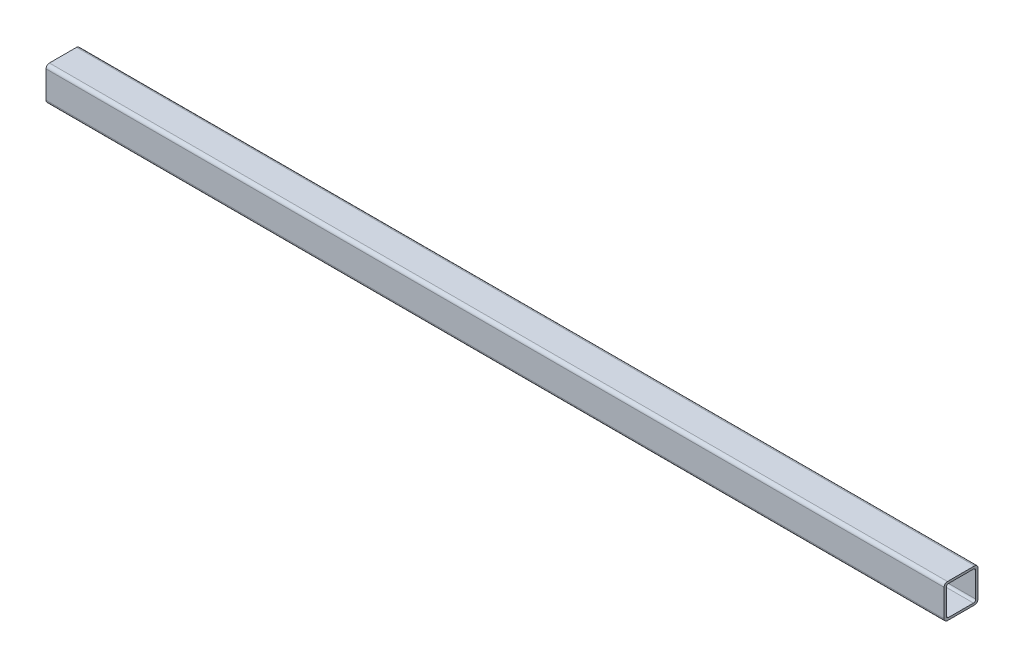
ISO-10303-21;
HEADER;
FILE_DESCRIPTION(('STEP AP214'),'2;1');
FILE_NAME('part.step','',(''),(''),'','','');
FILE_SCHEMA(('AUTOMOTIVE_DESIGN { 1 0 10303 214 1 1 1 1 }'));
ENDSEC;
DATA;
#1=APPLICATION_CONTEXT('core data for automotive mechanical design processes');
#2=APPLICATION_PROTOCOL_DEFINITION('international standard','automotive_design',2000,#1);
#3=PRODUCT_CONTEXT('',#1,'mechanical');
#4=PRODUCT('Part','Part','',(#3));
#5=PRODUCT_RELATED_PRODUCT_CATEGORY('part','',(#4));
#6=PRODUCT_DEFINITION_FORMATION('','',#4);
#7=PRODUCT_DEFINITION_CONTEXT('part definition',#1,'design');
#8=PRODUCT_DEFINITION('design','',#6,#7);
#9=PRODUCT_DEFINITION_SHAPE('','',#8);
#10=(LENGTH_UNIT() NAMED_UNIT(*) SI_UNIT(.MILLI.,.METRE.));
#11=(NAMED_UNIT(*) PLANE_ANGLE_UNIT() SI_UNIT($,.RADIAN.));
#12=(NAMED_UNIT(*) SI_UNIT($,.STERADIAN.) SOLID_ANGLE_UNIT());
#13=UNCERTAINTY_MEASURE_WITH_UNIT(LENGTH_MEASURE(1.E-05),#10,'distance_accuracy_value','');
#14=(GEOMETRIC_REPRESENTATION_CONTEXT(3) GLOBAL_UNCERTAINTY_ASSIGNED_CONTEXT((#13)) GLOBAL_UNIT_ASSIGNED_CONTEXT((#10,
#11,#12)) REPRESENTATION_CONTEXT('',''));
#15=CARTESIAN_POINT('',(0.,0.,0.));
#16=DIRECTION('',(0.,0.,1.));
#17=DIRECTION('',(1.,0.,0.));
#18=AXIS2_PLACEMENT_3D('',#15,#16,#17);
#19=CARTESIAN_POINT('',(-439.426406871193,0.,-3.));
#20=DIRECTION('',(0.,-1.,0.));
#21=DIRECTION('',(0.,0.,-1.));
#22=AXIS2_PLACEMENT_3D('',#19,#20,#21);
#23=PLANE('',#22);
#24=DIRECTION('',(0.,0.,1.));
#25=VECTOR('',#24,1.);
#26=CARTESIAN_POINT('',(-397.,0.,-3.));
#27=LINE('',#26,#25);
#28=CARTESIAN_POINT('',(-397.,0.,-27.));
#29=VERTEX_POINT('',#28);
#30=CARTESIAN_POINT('',(-397.,0.,-3.));
#31=VERTEX_POINT('',#30);
#32=EDGE_CURVE('E11',#29,#31,#27,.T.);
#33=ORIENTED_EDGE('',*,*,#32,.F.);
#34=DIRECTION('',(1.,0.,0.));
#35=VECTOR('',#34,1.);
#36=CARTESIAN_POINT('',(-439.426406871193,0.,-27.));
#37=LINE('',#36,#35);
#38=CARTESIAN_POINT('',(397.,0.,-27.));
#39=VERTEX_POINT('',#38);
#40=EDGE_CURVE('E237',#29,#39,#37,.T.);
#41=ORIENTED_EDGE('',*,*,#40,.T.);
#42=DIRECTION('',(0.,0.,1.));
#43=VECTOR('',#42,1.);
#44=CARTESIAN_POINT('',(397.,0.,-3.));
#45=LINE('',#44,#43);
#46=CARTESIAN_POINT('',(397.,0.,-3.));
#47=VERTEX_POINT('',#46);
#48=EDGE_CURVE('E154',#39,#47,#45,.T.);
#49=ORIENTED_EDGE('',*,*,#48,.T.);
#50=DIRECTION('',(1.,0.,0.));
#51=VECTOR('',#50,1.);
#52=CARTESIAN_POINT('',(-439.426406871193,0.,-3.));
#53=LINE('',#52,#51);
#54=EDGE_CURVE('E213',#31,#47,#53,.T.);
#55=ORIENTED_EDGE('',*,*,#54,.F.);
#56=EDGE_LOOP('',(#33,#41,#49,#55));
#57=FACE_BOUND('',#56,.T.);
#58=ADVANCED_FACE('F35',(#57),#23,.T.);
#59=CARTESIAN_POINT('',(-439.426406871193,3.,-27.));
#60=DIRECTION('',(1.,0.,0.));
#61=DIRECTION('',(0.,0.,-1.));
#62=AXIS2_PLACEMENT_3D('',#59,#60,#61);
#63=CYLINDRICAL_SURFACE('',#62,3.);
#64=CARTESIAN_POINT('',(-397.,3.,-27.));
#65=DIRECTION('',(1.,0.,0.));
#66=DIRECTION('',(0.,1.,0.));
#67=AXIS2_PLACEMENT_3D('',#64,#65,#66);
#68=CIRCLE('',#67,3.);
#69=CARTESIAN_POINT('',(-397.,3.,-30.));
#70=VERTEX_POINT('',#69);
#71=EDGE_CURVE('E199',#70,#29,#68,.F.);
#72=ORIENTED_EDGE('',*,*,#71,.F.);
#73=DIRECTION('',(1.,0.,0.));
#74=VECTOR('',#73,1.);
#75=CARTESIAN_POINT('',(-439.426406871193,3.,-30.));
#76=LINE('',#75,#74);
#77=CARTESIAN_POINT('',(397.,3.,-30.));
#78=VERTEX_POINT('',#77);
#79=EDGE_CURVE('E235',#70,#78,#76,.T.);
#80=ORIENTED_EDGE('',*,*,#79,.T.);
#81=CARTESIAN_POINT('',(397.,3.,-27.));
#82=DIRECTION('',(1.,0.,0.));
#83=DIRECTION('',(0.,1.,0.));
#84=AXIS2_PLACEMENT_3D('',#81,#82,#83);
#85=CIRCLE('',#84,3.);
#86=EDGE_CURVE('E172',#78,#39,#85,.F.);
#87=ORIENTED_EDGE('',*,*,#86,.T.);
#88=ORIENTED_EDGE('',*,*,#40,.F.);
#89=EDGE_LOOP('',(#72,#80,#87,#88));
#90=FACE_BOUND('',#89,.T.);
#91=ADVANCED_FACE('F297',(#90),#63,.T.);
#92=CARTESIAN_POINT('',(-439.426406871193,27.,-30.));
#93=DIRECTION('',(0.,0.,-1.));
#94=DIRECTION('',(0.,1.,0.));
#95=AXIS2_PLACEMENT_3D('',#92,#93,#94);
#96=PLANE('',#95);
#97=DIRECTION('',(0.,-1.,0.));
#98=VECTOR('',#97,1.);
#99=CARTESIAN_POINT('',(-397.,27.0000000000001,-30.));
#100=LINE('',#99,#98);
#101=CARTESIAN_POINT('',(-397.,27.,-30.));
#102=VERTEX_POINT('',#101);
#103=EDGE_CURVE('E201',#102,#70,#100,.T.);
#104=ORIENTED_EDGE('',*,*,#103,.F.);
#105=DIRECTION('',(1.,0.,0.));
#106=VECTOR('',#105,1.);
#107=CARTESIAN_POINT('',(-439.426406871193,27.,-30.));
#108=LINE('',#107,#106);
#109=CARTESIAN_POINT('',(397.,27.,-30.));
#110=VERTEX_POINT('',#109);
#111=EDGE_CURVE('E233',#102,#110,#108,.T.);
#112=ORIENTED_EDGE('',*,*,#111,.T.);
#113=DIRECTION('',(0.,-1.,0.));
#114=VECTOR('',#113,1.);
#115=CARTESIAN_POINT('',(397.,27.0000000000001,-30.));
#116=LINE('',#115,#114);
#117=EDGE_CURVE('E175',#110,#78,#116,.T.);
#118=ORIENTED_EDGE('',*,*,#117,.T.);
#119=ORIENTED_EDGE('',*,*,#79,.F.);
#120=EDGE_LOOP('',(#104,#112,#118,#119));
#121=FACE_BOUND('',#120,.T.);
#122=ADVANCED_FACE('F295',(#121),#96,.T.);
#123=CARTESIAN_POINT('',(-439.426406871193,27.,-27.));
#124=DIRECTION('',(1.,0.,0.));
#125=DIRECTION('',(0.,0.,-1.));
#126=AXIS2_PLACEMENT_3D('',#123,#124,#125);
#127=CYLINDRICAL_SURFACE('',#126,3.);
#128=CARTESIAN_POINT('',(-397.,27.,-27.));
#129=DIRECTION('',(1.,0.,0.));
#130=DIRECTION('',(0.,1.,0.));
#131=AXIS2_PLACEMENT_3D('',#128,#129,#130);
#132=CIRCLE('',#131,3.);
#133=CARTESIAN_POINT('',(-397.,30.,-27.));
#134=VERTEX_POINT('',#133);
#135=EDGE_CURVE('E203',#134,#102,#132,.F.);
#136=ORIENTED_EDGE('',*,*,#135,.F.);
#137=DIRECTION('',(1.,0.,0.));
#138=VECTOR('',#137,1.);
#139=CARTESIAN_POINT('',(-439.426406871193,30.,-27.));
#140=LINE('',#139,#138);
#141=CARTESIAN_POINT('',(397.,30.,-27.));
#142=VERTEX_POINT('',#141);
#143=EDGE_CURVE('E231',#134,#142,#140,.T.);
#144=ORIENTED_EDGE('',*,*,#143,.T.);
#145=CARTESIAN_POINT('',(397.,27.,-27.));
#146=DIRECTION('',(1.,0.,0.));
#147=DIRECTION('',(0.,1.,0.));
#148=AXIS2_PLACEMENT_3D('',#145,#146,#147);
#149=CIRCLE('',#148,3.);
#150=EDGE_CURVE('E262',#142,#110,#149,.F.);
#151=ORIENTED_EDGE('',*,*,#150,.T.);
#152=ORIENTED_EDGE('',*,*,#111,.F.);
#153=EDGE_LOOP('',(#136,#144,#151,#152));
#154=FACE_BOUND('',#153,.T.);
#155=ADVANCED_FACE('F288',(#154),#127,.T.);
#156=CARTESIAN_POINT('',(-439.426406871193,30.,-3.00000000000002));
#157=DIRECTION('',(0.,1.,0.));
#158=DIRECTION('',(0.,0.,1.));
#159=AXIS2_PLACEMENT_3D('',#156,#157,#158);
#160=PLANE('',#159);
#161=DIRECTION('',(0.,0.,-1.));
#162=VECTOR('',#161,1.);
#163=CARTESIAN_POINT('',(-397.,30.,-3.00000000000002));
#164=LINE('',#163,#162);
#165=CARTESIAN_POINT('',(-397.,30.,-3.00000000000002));
#166=VERTEX_POINT('',#165);
#167=EDGE_CURVE('E205',#166,#134,#164,.T.);
#168=ORIENTED_EDGE('',*,*,#167,.F.);
#169=DIRECTION('',(1.,0.,0.));
#170=VECTOR('',#169,1.);
#171=CARTESIAN_POINT('',(-439.426406871193,30.,-3.00000000000002));
#172=LINE('',#171,#170);
#173=CARTESIAN_POINT('',(397.,30.,-3.00000000000002));
#174=VERTEX_POINT('',#173);
#175=EDGE_CURVE('E229',#166,#174,#172,.T.);
#176=ORIENTED_EDGE('',*,*,#175,.T.);
#177=DIRECTION('',(0.,0.,-1.));
#178=VECTOR('',#177,1.);
#179=CARTESIAN_POINT('',(397.,30.,-3.00000000000002));
#180=LINE('',#179,#178);
#181=EDGE_CURVE('E265',#174,#142,#180,.T.);
#182=ORIENTED_EDGE('',*,*,#181,.T.);
#183=ORIENTED_EDGE('',*,*,#143,.F.);
#184=EDGE_LOOP('',(#168,#176,#182,#183));
#185=FACE_BOUND('',#184,.T.);
#186=ADVANCED_FACE('F286',(#185),#160,.T.);
#187=CARTESIAN_POINT('',(-439.426406871193,27.,-3.));
#188=DIRECTION('',(1.,0.,0.));
#189=DIRECTION('',(0.,0.,-1.));
#190=AXIS2_PLACEMENT_3D('',#187,#188,#189);
#191=CYLINDRICAL_SURFACE('',#190,3.);
#192=CARTESIAN_POINT('',(-397.,27.,-3.));
#193=DIRECTION('',(1.,0.,0.));
#194=DIRECTION('',(0.,1.,0.));
#195=AXIS2_PLACEMENT_3D('',#192,#193,#194);
#196=CIRCLE('',#195,3.);
#197=CARTESIAN_POINT('',(-397.,27.,0.));
#198=VERTEX_POINT('',#197);
#199=EDGE_CURVE('E207',#198,#166,#196,.F.);
#200=ORIENTED_EDGE('',*,*,#199,.F.);
#201=DIRECTION('',(1.,0.,0.));
#202=VECTOR('',#201,1.);
#203=CARTESIAN_POINT('',(-439.426406871193,27.,0.));
#204=LINE('',#203,#202);
#205=CARTESIAN_POINT('',(397.,27.,0.));
#206=VERTEX_POINT('',#205);
#207=EDGE_CURVE('E227',#198,#206,#204,.T.);
#208=ORIENTED_EDGE('',*,*,#207,.T.);
#209=CARTESIAN_POINT('',(397.,27.,-3.));
#210=DIRECTION('',(1.,0.,0.));
#211=DIRECTION('',(0.,1.,0.));
#212=AXIS2_PLACEMENT_3D('',#209,#210,#211);
#213=CIRCLE('',#212,3.);
#214=EDGE_CURVE('E268',#206,#174,#213,.F.);
#215=ORIENTED_EDGE('',*,*,#214,.T.);
#216=ORIENTED_EDGE('',*,*,#175,.F.);
#217=EDGE_LOOP('',(#200,#208,#215,#216));
#218=FACE_BOUND('',#217,.T.);
#219=ADVANCED_FACE('F279',(#218),#191,.T.);
#220=CARTESIAN_POINT('',(-439.426406871193,27.,0.));
#221=DIRECTION('',(0.,0.,1.));
#222=DIRECTION('',(1.,0.,0.));
#223=AXIS2_PLACEMENT_3D('',#220,#221,#222);
#224=PLANE('',#223);
#225=DIRECTION('',(0.,1.,0.));
#226=VECTOR('',#225,1.);
#227=CARTESIAN_POINT('',(-397.,27.,0.));
#228=LINE('',#227,#226);
#229=CARTESIAN_POINT('',(-397.,3.,0.));
#230=VERTEX_POINT('',#229);
#231=EDGE_CURVE('E209',#230,#198,#228,.T.);
#232=ORIENTED_EDGE('',*,*,#231,.F.);
#233=DIRECTION('',(1.,0.,0.));
#234=VECTOR('',#233,1.);
#235=CARTESIAN_POINT('',(-439.426406871193,3.,0.));
#236=LINE('',#235,#234);
#237=CARTESIAN_POINT('',(397.,3.,0.));
#238=VERTEX_POINT('',#237);
#239=EDGE_CURVE('E225',#230,#238,#236,.T.);
#240=ORIENTED_EDGE('',*,*,#239,.T.);
#241=DIRECTION('',(0.,1.,0.));
#242=VECTOR('',#241,1.);
#243=CARTESIAN_POINT('',(397.,27.,0.));
#244=LINE('',#243,#242);
#245=EDGE_CURVE('E253',#238,#206,#244,.T.);
#246=ORIENTED_EDGE('',*,*,#245,.T.);
#247=ORIENTED_EDGE('',*,*,#207,.F.);
#248=EDGE_LOOP('',(#232,#240,#246,#247));
#249=FACE_BOUND('',#248,.T.);
#250=ADVANCED_FACE('F273',(#249),#224,.T.);
#251=CARTESIAN_POINT('',(-439.426406871193,3.,-3.));
#252=DIRECTION('',(1.,0.,0.));
#253=DIRECTION('',(0.,0.,-1.));
#254=AXIS2_PLACEMENT_3D('',#251,#252,#253);
#255=CYLINDRICAL_SURFACE('',#254,3.);
#256=CARTESIAN_POINT('',(-397.,3.,-3.));
#257=DIRECTION('',(1.,0.,0.));
#258=DIRECTION('',(0.,1.,0.));
#259=AXIS2_PLACEMENT_3D('',#256,#257,#258);
#260=CIRCLE('',#259,3.);
#261=EDGE_CURVE('E197',#31,#230,#260,.F.);
#262=ORIENTED_EDGE('',*,*,#261,.F.);
#263=ORIENTED_EDGE('',*,*,#54,.T.);
#264=CARTESIAN_POINT('',(397.,3.,-3.));
#265=DIRECTION('',(1.,0.,0.));
#266=DIRECTION('',(0.,1.,0.));
#267=AXIS2_PLACEMENT_3D('',#264,#265,#266);
#268=CIRCLE('',#267,3.);
#269=EDGE_CURVE('E165',#47,#238,#268,.F.);
#270=ORIENTED_EDGE('',*,*,#269,.T.);
#271=ORIENTED_EDGE('',*,*,#239,.F.);
#272=EDGE_LOOP('',(#262,#263,#270,#271));
#273=FACE_BOUND('',#272,.T.);
#274=ADVANCED_FACE('F37',(#273),#255,.T.);
#275=CARTESIAN_POINT('',(-439.426406871193,2.,-4.00000000000001));
#276=DIRECTION('',(0.,-1.,0.));
#277=DIRECTION('',(0.,0.,-1.));
#278=AXIS2_PLACEMENT_3D('',#275,#276,#277);
#279=PLANE('',#278);
#280=DIRECTION('',(1.,0.,0.));
#281=VECTOR('',#280,1.);
#282=CARTESIAN_POINT('',(-439.426406871193,2.,-26.));
#283=LINE('',#282,#281);
#284=CARTESIAN_POINT('',(-397.,2.,-26.));
#285=VERTEX_POINT('',#284);
#286=CARTESIAN_POINT('',(397.,2.,-26.));
#287=VERTEX_POINT('',#286);
#288=EDGE_CURVE('E153',#285,#287,#283,.T.);
#289=ORIENTED_EDGE('',*,*,#288,.F.);
#290=DIRECTION('',(0.,0.,1.));
#291=VECTOR('',#290,1.);
#292=CARTESIAN_POINT('',(-397.,2.,-4.00000000000001));
#293=LINE('',#292,#291);
#294=CARTESIAN_POINT('',(-397.,2.,-4.00000000000001));
#295=VERTEX_POINT('',#294);
#296=EDGE_CURVE('E39',#285,#295,#293,.T.);
#297=ORIENTED_EDGE('',*,*,#296,.T.);
#298=DIRECTION('',(1.,0.,0.));
#299=VECTOR('',#298,1.);
#300=CARTESIAN_POINT('',(-439.426406871193,2.,-4.00000000000001));
#301=LINE('',#300,#299);
#302=CARTESIAN_POINT('',(397.,2.,-4.00000000000001));
#303=VERTEX_POINT('',#302);
#304=EDGE_CURVE('E145',#295,#303,#301,.T.);
#305=ORIENTED_EDGE('',*,*,#304,.T.);
#306=DIRECTION('',(0.,0.,1.));
#307=VECTOR('',#306,1.);
#308=CARTESIAN_POINT('',(397.,2.,-4.00000000000001));
#309=LINE('',#308,#307);
#310=EDGE_CURVE('E150',#287,#303,#309,.T.);
#311=ORIENTED_EDGE('',*,*,#310,.F.);
#312=EDGE_LOOP('',(#289,#297,#305,#311));
#313=FACE_BOUND('',#312,.T.);
#314=ADVANCED_FACE('F148',(#313),#279,.F.);
#315=CARTESIAN_POINT('',(-439.426406871193,4.,-26.));
#316=DIRECTION('',(1.,0.,0.));
#317=DIRECTION('',(0.,0.,-1.));
#318=AXIS2_PLACEMENT_3D('',#315,#316,#317);
#319=CYLINDRICAL_SURFACE('',#318,2.);
#320=DIRECTION('',(1.,0.,0.));
#321=VECTOR('',#320,1.);
#322=CARTESIAN_POINT('',(-439.426406871193,4.00000000000002,-28.));
#323=LINE('',#322,#321);
#324=CARTESIAN_POINT('',(-397.,4.00000000000002,-28.));
#325=VERTEX_POINT('',#324);
#326=CARTESIAN_POINT('',(397.,4.00000000000002,-28.));
#327=VERTEX_POINT('',#326);
#328=EDGE_CURVE('E222',#325,#327,#323,.T.);
#329=ORIENTED_EDGE('',*,*,#328,.F.);
#330=CARTESIAN_POINT('',(-397.,4.,-26.));
#331=DIRECTION('',(1.,0.,0.));
#332=DIRECTION('',(0.,1.,0.));
#333=AXIS2_PLACEMENT_3D('',#330,#331,#332);
#334=CIRCLE('',#333,2.);
#335=EDGE_CURVE('E44',#325,#285,#334,.F.);
#336=ORIENTED_EDGE('',*,*,#335,.T.);
#337=ORIENTED_EDGE('',*,*,#288,.T.);
#338=CARTESIAN_POINT('',(397.,4.,-26.));
#339=DIRECTION('',(1.,0.,0.));
#340=DIRECTION('',(0.,1.,0.));
#341=AXIS2_PLACEMENT_3D('',#338,#339,#340);
#342=CIRCLE('',#341,2.);
#343=EDGE_CURVE('E171',#327,#287,#342,.F.);
#344=ORIENTED_EDGE('',*,*,#343,.F.);
#345=EDGE_LOOP('',(#329,#336,#337,#344));
#346=FACE_BOUND('',#345,.T.);
#347=ADVANCED_FACE('F319',(#346),#319,.F.);
#348=CARTESIAN_POINT('',(-439.426406871193,26.,-28.));
#349=DIRECTION('',(0.,0.,-1.));
#350=DIRECTION('',(-1.,0.,0.));
#351=AXIS2_PLACEMENT_3D('',#348,#349,#350);
#352=PLANE('',#351);
#353=DIRECTION('',(1.,0.,0.));
#354=VECTOR('',#353,1.);
#355=CARTESIAN_POINT('',(-439.426406871193,26.,-28.));
#356=LINE('',#355,#354);
#357=CARTESIAN_POINT('',(-397.,26.,-28.));
#358=VERTEX_POINT('',#357);
#359=CARTESIAN_POINT('',(397.,26.,-28.));
#360=VERTEX_POINT('',#359);
#361=EDGE_CURVE('E220',#358,#360,#356,.T.);
#362=ORIENTED_EDGE('',*,*,#361,.F.);
#363=DIRECTION('',(0.,-1.,0.));
#364=VECTOR('',#363,1.);
#365=CARTESIAN_POINT('',(-397.,26.,-28.));
#366=LINE('',#365,#364);
#367=EDGE_CURVE('E181',#358,#325,#366,.T.);
#368=ORIENTED_EDGE('',*,*,#367,.T.);
#369=ORIENTED_EDGE('',*,*,#328,.T.);
#370=DIRECTION('',(0.,-1.,0.));
#371=VECTOR('',#370,1.);
#372=CARTESIAN_POINT('',(397.,26.,-28.));
#373=LINE('',#372,#371);
#374=EDGE_CURVE('E256',#360,#327,#373,.T.);
#375=ORIENTED_EDGE('',*,*,#374,.F.);
#376=EDGE_LOOP('',(#362,#368,#369,#375));
#377=FACE_BOUND('',#376,.T.);
#378=ADVANCED_FACE('F322',(#377),#352,.F.);
#379=CARTESIAN_POINT('',(-439.426406871193,26.,-26.));
#380=DIRECTION('',(1.,0.,0.));
#381=DIRECTION('',(0.,0.,-1.));
#382=AXIS2_PLACEMENT_3D('',#379,#380,#381);
#383=CYLINDRICAL_SURFACE('',#382,2.);
#384=DIRECTION('',(1.,0.,0.));
#385=VECTOR('',#384,1.);
#386=CARTESIAN_POINT('',(-439.426406871193,28.,-26.));
#387=LINE('',#386,#385);
#388=CARTESIAN_POINT('',(-397.,28.,-26.));
#389=VERTEX_POINT('',#388);
#390=CARTESIAN_POINT('',(397.,28.,-26.));
#391=VERTEX_POINT('',#390);
#392=EDGE_CURVE('E218',#389,#391,#387,.T.);
#393=ORIENTED_EDGE('',*,*,#392,.F.);
#394=CARTESIAN_POINT('',(-397.,26.,-26.));
#395=DIRECTION('',(1.,0.,0.));
#396=DIRECTION('',(0.,1.,0.));
#397=AXIS2_PLACEMENT_3D('',#394,#395,#396);
#398=CIRCLE('',#397,2.);
#399=EDGE_CURVE('E184',#389,#358,#398,.F.);
#400=ORIENTED_EDGE('',*,*,#399,.T.);
#401=ORIENTED_EDGE('',*,*,#361,.T.);
#402=CARTESIAN_POINT('',(397.,26.,-26.));
#403=DIRECTION('',(1.,0.,0.));
#404=DIRECTION('',(0.,1.,0.));
#405=AXIS2_PLACEMENT_3D('',#402,#403,#404);
#406=CIRCLE('',#405,2.);
#407=EDGE_CURVE('E511',#391,#360,#406,.F.);
#408=ORIENTED_EDGE('',*,*,#407,.F.);
#409=EDGE_LOOP('',(#393,#400,#401,#408));
#410=FACE_BOUND('',#409,.T.);
#411=ADVANCED_FACE('F326',(#410),#383,.F.);
#412=CARTESIAN_POINT('',(-439.426406871193,28.,-4.00000000000001));
#413=DIRECTION('',(0.,1.,0.));
#414=DIRECTION('',(0.,0.,1.));
#415=AXIS2_PLACEMENT_3D('',#412,#413,#414);
#416=PLANE('',#415);
#417=DIRECTION('',(1.,0.,0.));
#418=VECTOR('',#417,1.);
#419=CARTESIAN_POINT('',(-439.426406871193,28.,-4.00000000000001));
#420=LINE('',#419,#418);
#421=CARTESIAN_POINT('',(-397.,28.,-4.00000000000001));
#422=VERTEX_POINT('',#421);
#423=CARTESIAN_POINT('',(397.,28.,-4.00000000000001));
#424=VERTEX_POINT('',#423);
#425=EDGE_CURVE('E216',#422,#424,#420,.T.);
#426=ORIENTED_EDGE('',*,*,#425,.F.);
#427=DIRECTION('',(0.,0.,-1.));
#428=VECTOR('',#427,1.);
#429=CARTESIAN_POINT('',(-397.,28.,-4.00000000000001));
#430=LINE('',#429,#428);
#431=EDGE_CURVE('E187',#422,#389,#430,.T.);
#432=ORIENTED_EDGE('',*,*,#431,.T.);
#433=ORIENTED_EDGE('',*,*,#392,.T.);
#434=DIRECTION('',(0.,0.,-1.));
#435=VECTOR('',#434,1.);
#436=CARTESIAN_POINT('',(397.,28.,-4.00000000000001));
#437=LINE('',#436,#435);
#438=EDGE_CURVE('E507',#424,#391,#437,.T.);
#439=ORIENTED_EDGE('',*,*,#438,.F.);
#440=EDGE_LOOP('',(#426,#432,#433,#439));
#441=FACE_BOUND('',#440,.T.);
#442=ADVANCED_FACE('F330',(#441),#416,.F.);
#443=CARTESIAN_POINT('',(-439.426406871193,26.,-4.));
#444=DIRECTION('',(1.,0.,0.));
#445=DIRECTION('',(0.,0.,-1.));
#446=AXIS2_PLACEMENT_3D('',#443,#444,#445);
#447=CYLINDRICAL_SURFACE('',#446,2.);
#448=DIRECTION('',(1.,0.,0.));
#449=VECTOR('',#448,1.);
#450=CARTESIAN_POINT('',(-439.426406871193,26.,-2.));
#451=LINE('',#450,#449);
#452=CARTESIAN_POINT('',(-397.,26.,-2.));
#453=VERTEX_POINT('',#452);
#454=CARTESIAN_POINT('',(397.,26.,-2.));
#455=VERTEX_POINT('',#454);
#456=EDGE_CURVE('E214',#453,#455,#451,.T.);
#457=ORIENTED_EDGE('',*,*,#456,.F.);
#458=CARTESIAN_POINT('',(-397.,26.,-4.));
#459=DIRECTION('',(1.,0.,0.));
#460=DIRECTION('',(0.,1.,0.));
#461=AXIS2_PLACEMENT_3D('',#458,#459,#460);
#462=CIRCLE('',#461,2.);
#463=EDGE_CURVE('E190',#453,#422,#462,.F.);
#464=ORIENTED_EDGE('',*,*,#463,.T.);
#465=ORIENTED_EDGE('',*,*,#425,.T.);
#466=CARTESIAN_POINT('',(397.,26.,-4.));
#467=DIRECTION('',(1.,0.,0.));
#468=DIRECTION('',(0.,1.,0.));
#469=AXIS2_PLACEMENT_3D('',#466,#467,#468);
#470=CIRCLE('',#469,2.);
#471=EDGE_CURVE('E504',#455,#424,#470,.F.);
#472=ORIENTED_EDGE('',*,*,#471,.F.);
#473=EDGE_LOOP('',(#457,#464,#465,#472));
#474=FACE_BOUND('',#473,.T.);
#475=ADVANCED_FACE('F334',(#474),#447,.F.);
#476=CARTESIAN_POINT('',(-439.426406871193,26.,-2.));
#477=DIRECTION('',(0.,0.,1.));
#478=DIRECTION('',(1.,0.,0.));
#479=AXIS2_PLACEMENT_3D('',#476,#477,#478);
#480=PLANE('',#479);
#481=DIRECTION('',(1.,0.,0.));
#482=VECTOR('',#481,1.);
#483=CARTESIAN_POINT('',(-439.426406871193,4.00000000000002,-2.));
#484=LINE('',#483,#482);
#485=CARTESIAN_POINT('',(-397.,4.00000000000002,-2.));
#486=VERTEX_POINT('',#485);
#487=CARTESIAN_POINT('',(397.,4.00000000000002,-2.));
#488=VERTEX_POINT('',#487);
#489=EDGE_CURVE('E160',#486,#488,#484,.T.);
#490=ORIENTED_EDGE('',*,*,#489,.F.);
#491=DIRECTION('',(0.,1.,0.));
#492=VECTOR('',#491,1.);
#493=CARTESIAN_POINT('',(-397.,26.,-2.));
#494=LINE('',#493,#492);
#495=EDGE_CURVE('E193',#486,#453,#494,.T.);
#496=ORIENTED_EDGE('',*,*,#495,.T.);
#497=ORIENTED_EDGE('',*,*,#456,.T.);
#498=DIRECTION('',(0.,1.,0.));
#499=VECTOR('',#498,1.);
#500=CARTESIAN_POINT('',(397.,26.,-2.));
#501=LINE('',#500,#499);
#502=EDGE_CURVE('E164',#488,#455,#501,.T.);
#503=ORIENTED_EDGE('',*,*,#502,.F.);
#504=EDGE_LOOP('',(#490,#496,#497,#503));
#505=FACE_BOUND('',#504,.T.);
#506=ADVANCED_FACE('F316',(#505),#480,.F.);
#507=CARTESIAN_POINT('',(-439.426406871193,4.,-4.));
#508=DIRECTION('',(1.,0.,0.));
#509=DIRECTION('',(0.,0.,-1.));
#510=AXIS2_PLACEMENT_3D('',#507,#508,#509);
#511=CYLINDRICAL_SURFACE('',#510,2.);
#512=ORIENTED_EDGE('',*,*,#304,.F.);
#513=CARTESIAN_POINT('',(-397.,4.,-4.));
#514=DIRECTION('',(1.,0.,0.));
#515=DIRECTION('',(0.,1.,0.));
#516=AXIS2_PLACEMENT_3D('',#513,#514,#515);
#517=CIRCLE('',#516,2.);
#518=EDGE_CURVE('E196',#295,#486,#517,.F.);
#519=ORIENTED_EDGE('',*,*,#518,.T.);
#520=ORIENTED_EDGE('',*,*,#489,.T.);
#521=CARTESIAN_POINT('',(397.,4.,-4.));
#522=DIRECTION('',(1.,0.,0.));
#523=DIRECTION('',(0.,1.,0.));
#524=AXIS2_PLACEMENT_3D('',#521,#522,#523);
#525=CIRCLE('',#524,2.);
#526=EDGE_CURVE('E157',#303,#488,#525,.F.);
#527=ORIENTED_EDGE('',*,*,#526,.F.);
#528=EDGE_LOOP('',(#512,#519,#520,#527));
#529=FACE_BOUND('',#528,.T.);
#530=ADVANCED_FACE('F158',(#529),#511,.F.);
#531=CARTESIAN_POINT('',(-397.,0.,-270.149626863363));
#532=DIRECTION('',(1.,0.,0.));
#533=DIRECTION('',(0.,1.,0.));
#534=AXIS2_PLACEMENT_3D('',#531,#532,#533);
#535=PLANE('',#534);
#536=ORIENTED_EDGE('',*,*,#261,.T.);
#537=ORIENTED_EDGE('',*,*,#231,.T.);
#538=ORIENTED_EDGE('',*,*,#199,.T.);
#539=ORIENTED_EDGE('',*,*,#167,.T.);
#540=ORIENTED_EDGE('',*,*,#135,.T.);
#541=ORIENTED_EDGE('',*,*,#103,.T.);
#542=ORIENTED_EDGE('',*,*,#71,.T.);
#543=ORIENTED_EDGE('',*,*,#32,.T.);
#544=EDGE_LOOP('',(#536,#537,#538,#539,#540,#541,#542,#543));
#545=FACE_BOUND('',#544,.T.);
#546=ORIENTED_EDGE('',*,*,#296,.F.);
#547=ORIENTED_EDGE('',*,*,#335,.F.);
#548=ORIENTED_EDGE('',*,*,#367,.F.);
#549=ORIENTED_EDGE('',*,*,#399,.F.);
#550=ORIENTED_EDGE('',*,*,#431,.F.);
#551=ORIENTED_EDGE('',*,*,#463,.F.);
#552=ORIENTED_EDGE('',*,*,#495,.F.);
#553=ORIENTED_EDGE('',*,*,#518,.F.);
#554=EDGE_LOOP('',(#546,#547,#548,#549,#550,#551,#552,#553));
#555=FACE_BOUND('',#554,.T.);
#556=ADVANCED_FACE('F282',(#545,#555),#535,.F.);
#557=CARTESIAN_POINT('',(397.,0.,-270.149626863363));
#558=DIRECTION('',(-1.,0.,0.));
#559=DIRECTION('',(0.,1.,0.));
#560=AXIS2_PLACEMENT_3D('',#557,#558,#559);
#561=PLANE('',#560);
#562=ORIENTED_EDGE('',*,*,#269,.F.);
#563=ORIENTED_EDGE('',*,*,#48,.F.);
#564=ORIENTED_EDGE('',*,*,#86,.F.);
#565=ORIENTED_EDGE('',*,*,#117,.F.);
#566=ORIENTED_EDGE('',*,*,#150,.F.);
#567=ORIENTED_EDGE('',*,*,#181,.F.);
#568=ORIENTED_EDGE('',*,*,#214,.F.);
#569=ORIENTED_EDGE('',*,*,#245,.F.);
#570=EDGE_LOOP('',(#562,#563,#564,#565,#566,#567,#568,#569));
#571=FACE_BOUND('',#570,.T.);
#572=ORIENTED_EDGE('',*,*,#310,.T.);
#573=ORIENTED_EDGE('',*,*,#526,.T.);
#574=ORIENTED_EDGE('',*,*,#502,.T.);
#575=ORIENTED_EDGE('',*,*,#471,.T.);
#576=ORIENTED_EDGE('',*,*,#438,.T.);
#577=ORIENTED_EDGE('',*,*,#407,.T.);
#578=ORIENTED_EDGE('',*,*,#374,.T.);
#579=ORIENTED_EDGE('',*,*,#343,.T.);
#580=EDGE_LOOP('',(#572,#573,#574,#575,#576,#577,#578,#579));
#581=FACE_BOUND('',#580,.T.);
#582=ADVANCED_FACE('F168',(#571,#581),#561,.F.);
#583=CLOSED_SHELL('',(#58,#91,#122,#155,#186,#219,#250,#274,#314,#347,#378,#411,#442,#475,#506,
#530,#556,#582));
#584=MANIFOLD_SOLID_BREP('B2',#583);
#585=ADVANCED_BREP_SHAPE_REPRESENTATION('',(#18,#584),#14);
#586=SHAPE_DEFINITION_REPRESENTATION(#9,#585);
ENDSEC;
END-ISO-10303-21;
